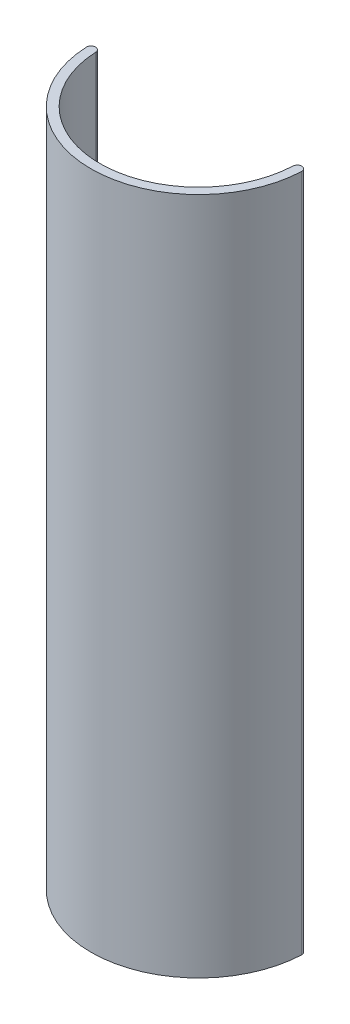
ISO-10303-21;
HEADER;
FILE_DESCRIPTION(('STEP AP214'),'2;1');
FILE_NAME('part.step','',(''),(''),'','','');
FILE_SCHEMA(('AUTOMOTIVE_DESIGN { 1 0 10303 214 1 1 1 1 }'));
ENDSEC;
DATA;
#1=APPLICATION_CONTEXT('core data for automotive mechanical design processes');
#2=APPLICATION_PROTOCOL_DEFINITION('international standard','automotive_design',2000,#1);
#3=PRODUCT_CONTEXT('',#1,'mechanical');
#4=PRODUCT('Part','Part','',(#3));
#5=PRODUCT_RELATED_PRODUCT_CATEGORY('part','',(#4));
#6=PRODUCT_DEFINITION_FORMATION('','',#4);
#7=PRODUCT_DEFINITION_CONTEXT('part definition',#1,'design');
#8=PRODUCT_DEFINITION('design','',#6,#7);
#9=PRODUCT_DEFINITION_SHAPE('','',#8);
#10=(LENGTH_UNIT() NAMED_UNIT(*) SI_UNIT(.MILLI.,.METRE.));
#11=(NAMED_UNIT(*) PLANE_ANGLE_UNIT() SI_UNIT($,.RADIAN.));
#12=(NAMED_UNIT(*) SI_UNIT($,.STERADIAN.) SOLID_ANGLE_UNIT());
#13=UNCERTAINTY_MEASURE_WITH_UNIT(LENGTH_MEASURE(1.E-05),#10,'distance_accuracy_value','');
#14=(GEOMETRIC_REPRESENTATION_CONTEXT(3) GLOBAL_UNCERTAINTY_ASSIGNED_CONTEXT((#13)) GLOBAL_UNIT_ASSIGNED_CONTEXT((#10,
#11,#12)) REPRESENTATION_CONTEXT('',''));
#15=CARTESIAN_POINT('',(0.,0.,0.));
#16=DIRECTION('',(0.,0.,1.));
#17=DIRECTION('',(1.,0.,0.));
#18=AXIS2_PLACEMENT_3D('',#15,#16,#17);
#19=CARTESIAN_POINT('',(-18.1816666666667,150.,0.));
#20=DIRECTION('',(0.,-1.,0.));
#21=DIRECTION('',(0.,0.,-1.));
#22=AXIS2_PLACEMENT_3D('',#19,#20,#21);
#23=CYLINDRICAL_SURFACE('',#22,21.8183333333333);
#24=CARTESIAN_POINT('',(-18.1816666666667,150.,0.));
#25=DIRECTION('',(0.,-1.,0.));
#26=DIRECTION('',(0.,0.,1.));
#27=AXIS2_PLACEMENT_3D('',#24,#25,#26);
#28=CIRCLE('',#27,21.8183333333333);
#29=CARTESIAN_POINT('',(3.61570468140896,150.,0.956175589803523));
#30=VERTEX_POINT('',#29);
#31=CARTESIAN_POINT('',(-39.9790380147423,150.,0.956175589803519));
#32=VERTEX_POINT('',#31);
#33=EDGE_CURVE('E95',#30,#32,#28,.T.);
#34=ORIENTED_EDGE('',*,*,#33,.F.);
#35=DIRECTION('',(0.,-1.,0.));
#36=VECTOR('',#35,1.);
#37=CARTESIAN_POINT('',(3.61570468140896,150.,0.956175589803523));
#38=LINE('',#37,#36);
#39=CARTESIAN_POINT('',(3.61570468140896,0.,0.956175589803523));
#40=VERTEX_POINT('',#39);
#41=EDGE_CURVE('E11',#30,#40,#38,.T.);
#42=ORIENTED_EDGE('',*,*,#41,.T.);
#43=CARTESIAN_POINT('',(-18.1816666666667,0.,0.));
#44=DIRECTION('',(0.,-1.,0.));
#45=DIRECTION('',(0.,0.,1.));
#46=AXIS2_PLACEMENT_3D('',#43,#44,#45);
#47=CIRCLE('',#46,21.8183333333333);
#48=CARTESIAN_POINT('',(-39.9790380147423,0.,0.956175589803519));
#49=VERTEX_POINT('',#48);
#50=EDGE_CURVE('E93',#40,#49,#47,.T.);
#51=ORIENTED_EDGE('',*,*,#50,.T.);
#52=DIRECTION('',(0.,-1.,0.));
#53=VECTOR('',#52,1.);
#54=CARTESIAN_POINT('',(-39.9790380147423,150.,0.956175589803519));
#55=LINE('',#54,#53);
#56=EDGE_CURVE('E46',#49,#32,#55,.F.);
#57=ORIENTED_EDGE('',*,*,#56,.T.);
#58=EDGE_LOOP('',(#34,#42,#51,#57));
#59=FACE_BOUND('',#58,.T.);
#60=ADVANCED_FACE('F37',(#59),#23,.F.);
#61=CARTESIAN_POINT('',(-18.1816666666667,150.,0.));
#62=DIRECTION('',(0.,-1.,0.));
#63=DIRECTION('',(0.,0.,-1.));
#64=AXIS2_PLACEMENT_3D('',#61,#62,#63);
#65=CYLINDRICAL_SURFACE('',#64,23.8183333333333);
#66=CARTESIAN_POINT('',(-18.1816666666667,0.,0.));
#67=DIRECTION('',(0.,1.,0.));
#68=DIRECTION('',(0.,0.,1.));
#69=AXIS2_PLACEMENT_3D('',#66,#67,#68);
#70=CIRCLE('',#69,23.8183333333333);
#71=CARTESIAN_POINT('',(-41.9771165127708,0.,1.04382441019648));
#72=VERTEX_POINT('',#71);
#73=CARTESIAN_POINT('',(5.61378317943745,0.,1.04382441019648));
#74=VERTEX_POINT('',#73);
#75=EDGE_CURVE('E104',#72,#74,#70,.T.);
#76=ORIENTED_EDGE('',*,*,#75,.T.);
#77=DIRECTION('',(0.,-1.,0.));
#78=VECTOR('',#77,1.);
#79=CARTESIAN_POINT('',(5.61378317943745,150.,1.04382441019648));
#80=LINE('',#79,#78);
#81=CARTESIAN_POINT('',(5.61378317943745,150.,1.04382441019648));
#82=VERTEX_POINT('',#81);
#83=EDGE_CURVE('E119',#74,#82,#80,.F.);
#84=ORIENTED_EDGE('',*,*,#83,.T.);
#85=CARTESIAN_POINT('',(-18.1816666666667,150.,0.));
#86=DIRECTION('',(0.,1.,0.));
#87=DIRECTION('',(0.,0.,1.));
#88=AXIS2_PLACEMENT_3D('',#85,#86,#87);
#89=CIRCLE('',#88,23.8183333333333);
#90=CARTESIAN_POINT('',(-41.9771165127708,150.,1.04382441019648));
#91=VERTEX_POINT('',#90);
#92=EDGE_CURVE('E138',#91,#82,#89,.T.);
#93=ORIENTED_EDGE('',*,*,#92,.F.);
#94=DIRECTION('',(0.,-1.,0.));
#95=VECTOR('',#94,1.);
#96=CARTESIAN_POINT('',(-41.9771165127708,150.,1.04382441019648));
#97=LINE('',#96,#95);
#98=EDGE_CURVE('E112',#91,#72,#97,.T.);
#99=ORIENTED_EDGE('',*,*,#98,.T.);
#100=EDGE_LOOP('',(#76,#84,#93,#99));
#101=FACE_BOUND('',#100,.T.);
#102=ADVANCED_FACE('F141',(#101),#65,.T.);
#103=CARTESIAN_POINT('',(-18.1816666666667,150.,0.));
#104=DIRECTION('',(0.,1.,0.));
#105=DIRECTION('',(0.,0.,1.));
#106=AXIS2_PLACEMENT_3D('',#103,#104,#105);
#107=PLANE('',#106);
#108=ORIENTED_EDGE('',*,*,#92,.T.);
#109=CARTESIAN_POINT('',(4.6147439304232,150.,1.));
#110=DIRECTION('',(0.,1.,0.));
#111=DIRECTION('',(0.,0.,1.));
#112=AXIS2_PLACEMENT_3D('',#109,#110,#111);
#113=CIRCLE('',#112,1.);
#114=CARTESIAN_POINT('',(4.6147439304232,150.,0.));
#115=VERTEX_POINT('',#114);
#116=EDGE_CURVE('E54',#82,#115,#113,.T.);
#117=ORIENTED_EDGE('',*,*,#116,.T.);
#118=CARTESIAN_POINT('',(4.6147439304232,150.,1.));
#119=DIRECTION('',(0.,1.,0.));
#120=DIRECTION('',(0.,0.,1.));
#121=AXIS2_PLACEMENT_3D('',#118,#119,#120);
#122=CIRCLE('',#121,1.);
#123=EDGE_CURVE('E125',#115,#30,#122,.T.);
#124=ORIENTED_EDGE('',*,*,#123,.T.);
#125=ORIENTED_EDGE('',*,*,#33,.T.);
#126=CARTESIAN_POINT('',(-40.9780772637565,150.,0.999999999999999));
#127=DIRECTION('',(0.,1.,0.));
#128=DIRECTION('',(0.,0.,1.));
#129=AXIS2_PLACEMENT_3D('',#126,#127,#128);
#130=CIRCLE('',#129,1.);
#131=CARTESIAN_POINT('',(-40.9780772637565,150.,0.));
#132=VERTEX_POINT('',#131);
#133=EDGE_CURVE('E61',#32,#132,#130,.T.);
#134=ORIENTED_EDGE('',*,*,#133,.T.);
#135=CARTESIAN_POINT('',(-40.9780772637565,150.,0.999999999999999));
#136=DIRECTION('',(0.,1.,0.));
#137=DIRECTION('',(0.,0.,1.));
#138=AXIS2_PLACEMENT_3D('',#135,#136,#137);
#139=CIRCLE('',#138,1.);
#140=EDGE_CURVE('E122',#132,#91,#139,.T.);
#141=ORIENTED_EDGE('',*,*,#140,.T.);
#142=EDGE_LOOP('',(#108,#117,#124,#125,#134,#141));
#143=FACE_BOUND('',#142,.T.);
#144=ADVANCED_FACE('F137',(#143),#107,.T.);
#145=CARTESIAN_POINT('',(-18.1816666666667,0.,0.));
#146=DIRECTION('',(0.,1.,0.));
#147=DIRECTION('',(0.,0.,1.));
#148=AXIS2_PLACEMENT_3D('',#145,#146,#147);
#149=PLANE('',#148);
#150=CARTESIAN_POINT('',(4.6147439304232,0.,1.));
#151=DIRECTION('',(0.,1.,0.));
#152=DIRECTION('',(0.,0.,1.));
#153=AXIS2_PLACEMENT_3D('',#150,#151,#152);
#154=CIRCLE('',#153,1.);
#155=CARTESIAN_POINT('',(4.6147439304232,0.,0.));
#156=VERTEX_POINT('',#155);
#157=EDGE_CURVE('E100',#40,#156,#154,.F.);
#158=ORIENTED_EDGE('',*,*,#157,.T.);
#159=CARTESIAN_POINT('',(4.6147439304232,0.,1.));
#160=DIRECTION('',(0.,1.,0.));
#161=DIRECTION('',(0.,0.,1.));
#162=AXIS2_PLACEMENT_3D('',#159,#160,#161);
#163=CIRCLE('',#162,1.);
#164=EDGE_CURVE('E110',#156,#74,#163,.F.);
#165=ORIENTED_EDGE('',*,*,#164,.T.);
#166=ORIENTED_EDGE('',*,*,#75,.F.);
#167=CARTESIAN_POINT('',(-40.9780772637565,0.,0.999999999999999));
#168=DIRECTION('',(0.,1.,0.));
#169=DIRECTION('',(0.,0.,1.));
#170=AXIS2_PLACEMENT_3D('',#167,#168,#169);
#171=CIRCLE('',#170,1.);
#172=CARTESIAN_POINT('',(-40.9780772637565,0.,0.));
#173=VERTEX_POINT('',#172);
#174=EDGE_CURVE('E114',#72,#173,#171,.F.);
#175=ORIENTED_EDGE('',*,*,#174,.T.);
#176=CARTESIAN_POINT('',(-40.9780772637565,0.,0.999999999999999));
#177=DIRECTION('',(0.,1.,0.));
#178=DIRECTION('',(0.,0.,1.));
#179=AXIS2_PLACEMENT_3D('',#176,#177,#178);
#180=CIRCLE('',#179,1.);
#181=EDGE_CURVE('E103',#173,#49,#180,.F.);
#182=ORIENTED_EDGE('',*,*,#181,.T.);
#183=ORIENTED_EDGE('',*,*,#50,.F.);
#184=EDGE_LOOP('',(#158,#165,#166,#175,#182,#183));
#185=FACE_BOUND('',#184,.T.);
#186=ADVANCED_FACE('F99',(#185),#149,.F.);
#187=CARTESIAN_POINT('',(4.6147439304232,150.,1.));
#188=DIRECTION('',(0.,-1.,0.));
#189=DIRECTION('',(0.,0.,-1.));
#190=AXIS2_PLACEMENT_3D('',#187,#188,#189);
#191=CYLINDRICAL_SURFACE('',#190,1.);
#192=ORIENTED_EDGE('',*,*,#41,.F.);
#193=ORIENTED_EDGE('',*,*,#123,.F.);
#194=DIRECTION('',(0.,-1.,0.));
#195=VECTOR('',#194,1.);
#196=CARTESIAN_POINT('',(4.6147439304232,150.,0.));
#197=LINE('',#196,#195);
#198=EDGE_CURVE('E105',#156,#115,#197,.F.);
#199=ORIENTED_EDGE('',*,*,#198,.F.);
#200=ORIENTED_EDGE('',*,*,#157,.F.);
#201=EDGE_LOOP('',(#192,#193,#199,#200));
#202=FACE_BOUND('',#201,.T.);
#203=ADVANCED_FACE('F107',(#202),#191,.T.);
#204=CARTESIAN_POINT('',(4.6147439304232,150.,1.));
#205=DIRECTION('',(0.,-1.,0.));
#206=DIRECTION('',(0.,0.,-1.));
#207=AXIS2_PLACEMENT_3D('',#204,#205,#206);
#208=CYLINDRICAL_SURFACE('',#207,1.);
#209=ORIENTED_EDGE('',*,*,#116,.F.);
#210=ORIENTED_EDGE('',*,*,#83,.F.);
#211=ORIENTED_EDGE('',*,*,#164,.F.);
#212=ORIENTED_EDGE('',*,*,#198,.T.);
#213=EDGE_LOOP('',(#209,#210,#211,#212));
#214=FACE_BOUND('',#213,.T.);
#215=ADVANCED_FACE('F147',(#214),#208,.T.);
#216=CARTESIAN_POINT('',(-40.9780772637565,150.,0.999999999999999));
#217=DIRECTION('',(0.,-1.,0.));
#218=DIRECTION('',(0.,0.,-1.));
#219=AXIS2_PLACEMENT_3D('',#216,#217,#218);
#220=CYLINDRICAL_SURFACE('',#219,1.);
#221=ORIENTED_EDGE('',*,*,#98,.F.);
#222=ORIENTED_EDGE('',*,*,#140,.F.);
#223=DIRECTION('',(0.,-1.,0.));
#224=VECTOR('',#223,1.);
#225=CARTESIAN_POINT('',(-40.9780772637565,150.,0.));
#226=LINE('',#225,#224);
#227=EDGE_CURVE('E41',#173,#132,#226,.F.);
#228=ORIENTED_EDGE('',*,*,#227,.F.);
#229=ORIENTED_EDGE('',*,*,#174,.F.);
#230=EDGE_LOOP('',(#221,#222,#228,#229));
#231=FACE_BOUND('',#230,.T.);
#232=ADVANCED_FACE('F39',(#231),#220,.T.);
#233=CARTESIAN_POINT('',(-40.9780772637565,150.,0.999999999999999));
#234=DIRECTION('',(0.,-1.,0.));
#235=DIRECTION('',(0.,0.,-1.));
#236=AXIS2_PLACEMENT_3D('',#233,#234,#235);
#237=CYLINDRICAL_SURFACE('',#236,1.);
#238=ORIENTED_EDGE('',*,*,#133,.F.);
#239=ORIENTED_EDGE('',*,*,#56,.F.);
#240=ORIENTED_EDGE('',*,*,#181,.F.);
#241=ORIENTED_EDGE('',*,*,#227,.T.);
#242=EDGE_LOOP('',(#238,#239,#240,#241));
#243=FACE_BOUND('',#242,.T.);
#244=ADVANCED_FACE('F132',(#243),#237,.T.);
#245=CLOSED_SHELL('',(#60,#102,#144,#186,#203,#215,#232,#244));
#246=MANIFOLD_SOLID_BREP('B2',#245);
#247=ADVANCED_BREP_SHAPE_REPRESENTATION('',(#18,#246),#14);
#248=SHAPE_DEFINITION_REPRESENTATION(#9,#247);
ENDSEC;
END-ISO-10303-21;
